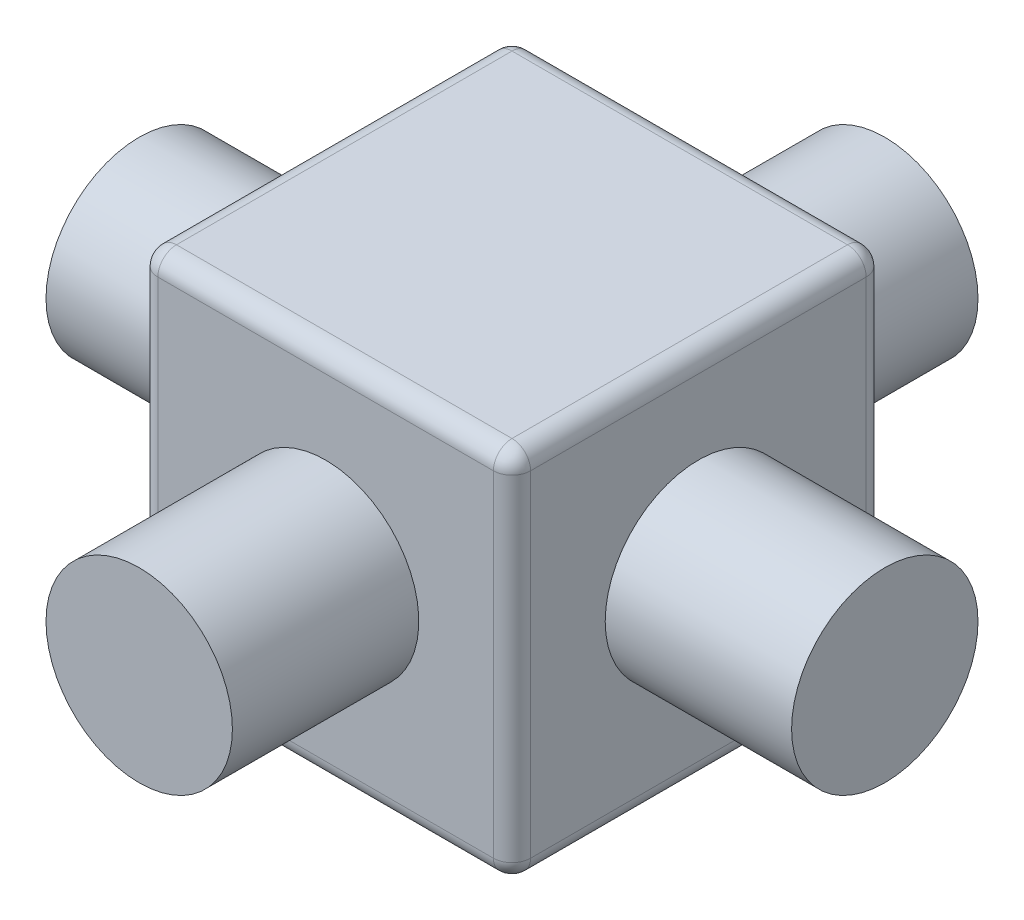
ISO-10303-21;
HEADER;
FILE_DESCRIPTION(('STEP AP214'),'2;1');
FILE_NAME('part.step','',(''),(''),'','','');
FILE_SCHEMA(('AUTOMOTIVE_DESIGN { 1 0 10303 214 1 1 1 1 }'));
ENDSEC;
DATA;
#1=APPLICATION_CONTEXT('core data for automotive mechanical design processes');
#2=APPLICATION_PROTOCOL_DEFINITION('international standard','automotive_design',2000,#1);
#3=PRODUCT_CONTEXT('',#1,'mechanical');
#4=PRODUCT('Part','Part','',(#3));
#5=PRODUCT_RELATED_PRODUCT_CATEGORY('part','',(#4));
#6=PRODUCT_DEFINITION_FORMATION('','',#4);
#7=PRODUCT_DEFINITION_CONTEXT('part definition',#1,'design');
#8=PRODUCT_DEFINITION('design','',#6,#7);
#9=PRODUCT_DEFINITION_SHAPE('','',#8);
#10=(LENGTH_UNIT() NAMED_UNIT(*) SI_UNIT(.MILLI.,.METRE.));
#11=(NAMED_UNIT(*) PLANE_ANGLE_UNIT() SI_UNIT($,.RADIAN.));
#12=(NAMED_UNIT(*) SI_UNIT($,.STERADIAN.) SOLID_ANGLE_UNIT());
#13=UNCERTAINTY_MEASURE_WITH_UNIT(LENGTH_MEASURE(1.E-05),#10,'distance_accuracy_value','');
#14=(GEOMETRIC_REPRESENTATION_CONTEXT(3) GLOBAL_UNCERTAINTY_ASSIGNED_CONTEXT((#13)) GLOBAL_UNIT_ASSIGNED_CONTEXT((#10,
#11,#12)) REPRESENTATION_CONTEXT('',''));
#15=CARTESIAN_POINT('',(0.,0.,0.));
#16=DIRECTION('',(0.,0.,1.));
#17=DIRECTION('',(1.,0.,0.));
#18=AXIS2_PLACEMENT_3D('',#15,#16,#17);
#19=CARTESIAN_POINT('',(3.,6.,3.));
#20=DIRECTION('',(-1.,0.,0.));
#21=DIRECTION('',(0.,0.,1.));
#22=AXIS2_PLACEMENT_3D('',#19,#20,#21);
#23=PLANE('',#22);
#24=CARTESIAN_POINT('',(3.,3.,0.));
#25=DIRECTION('',(-1.,0.,0.));
#26=DIRECTION('',(0.,0.,1.));
#27=AXIS2_PLACEMENT_3D('',#24,#25,#26);
#28=CIRCLE('',#27,1.5);
#29=CARTESIAN_POINT('',(3.,3.,1.49999999999997));
#30=VERTEX_POINT('',#29);
#31=EDGE_CURVE('E11',#30,#30,#28,.F.);
#32=ORIENTED_EDGE('',*,*,#31,.F.);
#33=EDGE_LOOP('',(#32));
#34=FACE_BOUND('',#33,.T.);
#35=DIRECTION('',(0.,0.,-1.));
#36=VECTOR('',#35,1.);
#37=CARTESIAN_POINT('',(3.,0.3,-3.));
#38=LINE('',#37,#36);
#39=CARTESIAN_POINT('',(3.,0.3,2.7));
#40=VERTEX_POINT('',#39);
#41=CARTESIAN_POINT('',(3.,0.3,-2.7));
#42=VERTEX_POINT('',#41);
#43=EDGE_CURVE('E335',#40,#42,#38,.T.);
#44=ORIENTED_EDGE('',*,*,#43,.T.);
#45=DIRECTION('',(0.,-1.,0.));
#46=VECTOR('',#45,1.);
#47=CARTESIAN_POINT('',(3.,6.,-2.7));
#48=LINE('',#47,#46);
#49=CARTESIAN_POINT('',(3.,5.7,-2.7));
#50=VERTEX_POINT('',#49);
#51=EDGE_CURVE('E338',#42,#50,#48,.F.);
#52=ORIENTED_EDGE('',*,*,#51,.T.);
#53=DIRECTION('',(0.,0.,-1.));
#54=VECTOR('',#53,1.);
#55=CARTESIAN_POINT('',(3.,5.7,3.));
#56=LINE('',#55,#54);
#57=CARTESIAN_POINT('',(3.,5.7,2.7));
#58=VERTEX_POINT('',#57);
#59=EDGE_CURVE('E329',#50,#58,#56,.F.);
#60=ORIENTED_EDGE('',*,*,#59,.T.);
#61=DIRECTION('',(0.,-1.,0.));
#62=VECTOR('',#61,1.);
#63=CARTESIAN_POINT('',(3.,6.,2.7));
#64=LINE('',#63,#62);
#65=EDGE_CURVE('E332',#58,#40,#64,.T.);
#66=ORIENTED_EDGE('',*,*,#65,.T.);
#67=EDGE_LOOP('',(#44,#52,#60,#66));
#68=FACE_BOUND('',#67,.T.);
#69=ADVANCED_FACE('F39',(#34,#68),#23,.F.);
#70=CARTESIAN_POINT('',(-3.,6.,-3.));
#71=DIRECTION('',(0.,0.,1.));
#72=DIRECTION('',(1.,0.,0.));
#73=AXIS2_PLACEMENT_3D('',#70,#71,#72);
#74=PLANE('',#73);
#75=CARTESIAN_POINT('',(0.,3.,-3.));
#76=DIRECTION('',(0.,0.,1.));
#77=DIRECTION('',(1.,0.,0.));
#78=AXIS2_PLACEMENT_3D('',#75,#76,#77);
#79=CIRCLE('',#78,1.5);
#80=CARTESIAN_POINT('',(1.5,3.,-3.));
#81=VERTEX_POINT('',#80);
#82=EDGE_CURVE('E226',#81,#81,#79,.F.);
#83=ORIENTED_EDGE('',*,*,#82,.F.);
#84=EDGE_LOOP('',(#83));
#85=FACE_BOUND('',#84,.T.);
#86=DIRECTION('',(-1.,0.,0.));
#87=VECTOR('',#86,1.);
#88=CARTESIAN_POINT('',(-3.,0.3,-3.));
#89=LINE('',#88,#87);
#90=CARTESIAN_POINT('',(2.7,0.3,-3.));
#91=VERTEX_POINT('',#90);
#92=CARTESIAN_POINT('',(-2.7,0.3,-3.));
#93=VERTEX_POINT('',#92);
#94=EDGE_CURVE('E322',#91,#93,#89,.T.);
#95=ORIENTED_EDGE('',*,*,#94,.T.);
#96=DIRECTION('',(0.,-1.,0.));
#97=VECTOR('',#96,1.);
#98=CARTESIAN_POINT('',(-2.7,6.,-3.));
#99=LINE('',#98,#97);
#100=CARTESIAN_POINT('',(-2.7,5.7,-3.));
#101=VERTEX_POINT('',#100);
#102=EDGE_CURVE('E325',#93,#101,#99,.F.);
#103=ORIENTED_EDGE('',*,*,#102,.T.);
#104=DIRECTION('',(-1.,0.,0.));
#105=VECTOR('',#104,1.);
#106=CARTESIAN_POINT('',(-3.,5.7,-3.));
#107=LINE('',#106,#105);
#108=CARTESIAN_POINT('',(2.7,5.7,-3.));
#109=VERTEX_POINT('',#108);
#110=EDGE_CURVE('E313',#101,#109,#107,.F.);
#111=ORIENTED_EDGE('',*,*,#110,.T.);
#112=DIRECTION('',(0.,-1.,0.));
#113=VECTOR('',#112,1.);
#114=CARTESIAN_POINT('',(2.7,6.,-3.));
#115=LINE('',#114,#113);
#116=EDGE_CURVE('E316',#109,#91,#115,.T.);
#117=ORIENTED_EDGE('',*,*,#116,.T.);
#118=EDGE_LOOP('',(#95,#103,#111,#117));
#119=FACE_BOUND('',#118,.T.);
#120=ADVANCED_FACE('F361',(#85,#119),#74,.F.);
#121=CARTESIAN_POINT('',(-3.,6.,3.));
#122=DIRECTION('',(1.,0.,0.));
#123=DIRECTION('',(0.,0.,-1.));
#124=AXIS2_PLACEMENT_3D('',#121,#122,#123);
#125=PLANE('',#124);
#126=CARTESIAN_POINT('',(-3.,3.,0.));
#127=DIRECTION('',(1.,0.,0.));
#128=DIRECTION('',(0.,0.,-1.));
#129=AXIS2_PLACEMENT_3D('',#126,#127,#128);
#130=CIRCLE('',#129,1.5);
#131=CARTESIAN_POINT('',(-3.,3.,-1.49999999999999));
#132=VERTEX_POINT('',#131);
#133=EDGE_CURVE('E230',#132,#132,#130,.F.);
#134=ORIENTED_EDGE('',*,*,#133,.F.);
#135=EDGE_LOOP('',(#134));
#136=FACE_BOUND('',#135,.T.);
#137=DIRECTION('',(0.,-1.,0.));
#138=VECTOR('',#137,1.);
#139=CARTESIAN_POINT('',(-3.,6.,-2.7));
#140=LINE('',#139,#138);
#141=CARTESIAN_POINT('',(-3.,5.7,-2.7));
#142=VERTEX_POINT('',#141);
#143=CARTESIAN_POINT('',(-3.,0.3,-2.7));
#144=VERTEX_POINT('',#143);
#145=EDGE_CURVE('E139',#142,#144,#140,.T.);
#146=ORIENTED_EDGE('',*,*,#145,.T.);
#147=DIRECTION('',(0.,0.,1.));
#148=VECTOR('',#147,1.);
#149=CARTESIAN_POINT('',(-3.,0.3,3.));
#150=LINE('',#149,#148);
#151=CARTESIAN_POINT('',(-3.,0.3,2.7));
#152=VERTEX_POINT('',#151);
#153=EDGE_CURVE('E134',#144,#152,#150,.T.);
#154=ORIENTED_EDGE('',*,*,#153,.T.);
#155=DIRECTION('',(0.,-1.,0.));
#156=VECTOR('',#155,1.);
#157=CARTESIAN_POINT('',(-3.,6.,2.7));
#158=LINE('',#157,#156);
#159=CARTESIAN_POINT('',(-3.,5.7,2.7));
#160=VERTEX_POINT('',#159);
#161=EDGE_CURVE('E128',#152,#160,#158,.F.);
#162=ORIENTED_EDGE('',*,*,#161,.T.);
#163=DIRECTION('',(0.,0.,1.));
#164=VECTOR('',#163,1.);
#165=CARTESIAN_POINT('',(-3.,5.7,3.));
#166=LINE('',#165,#164);
#167=EDGE_CURVE('E131',#160,#142,#166,.F.);
#168=ORIENTED_EDGE('',*,*,#167,.T.);
#169=EDGE_LOOP('',(#146,#154,#162,#168));
#170=FACE_BOUND('',#169,.T.);
#171=ADVANCED_FACE('F130',(#136,#170),#125,.F.);
#172=CARTESIAN_POINT('',(-3.,6.,3.));
#173=DIRECTION('',(0.,0.,-1.));
#174=DIRECTION('',(-1.,0.,0.));
#175=AXIS2_PLACEMENT_3D('',#172,#173,#174);
#176=PLANE('',#175);
#177=CARTESIAN_POINT('',(0.,3.,3.));
#178=DIRECTION('',(0.,0.,-1.));
#179=DIRECTION('',(-1.,0.,0.));
#180=AXIS2_PLACEMENT_3D('',#177,#178,#179);
#181=CIRCLE('',#180,1.5);
#182=CARTESIAN_POINT('',(-1.5,3.,3.));
#183=VERTEX_POINT('',#182);
#184=EDGE_CURVE('E48',#183,#183,#181,.F.);
#185=ORIENTED_EDGE('',*,*,#184,.F.);
#186=EDGE_LOOP('',(#185));
#187=FACE_BOUND('',#186,.T.);
#188=DIRECTION('',(0.,-1.,0.));
#189=VECTOR('',#188,1.);
#190=CARTESIAN_POINT('',(-2.7,6.,3.));
#191=LINE('',#190,#189);
#192=CARTESIAN_POINT('',(-2.7,5.7,3.));
#193=VERTEX_POINT('',#192);
#194=CARTESIAN_POINT('',(-2.7,0.3,3.));
#195=VERTEX_POINT('',#194);
#196=EDGE_CURVE('E164',#193,#195,#191,.T.);
#197=ORIENTED_EDGE('',*,*,#196,.T.);
#198=DIRECTION('',(1.,0.,0.));
#199=VECTOR('',#198,1.);
#200=CARTESIAN_POINT('',(3.,0.3,3.));
#201=LINE('',#200,#199);
#202=CARTESIAN_POINT('',(2.7,0.3,3.));
#203=VERTEX_POINT('',#202);
#204=EDGE_CURVE('E246',#195,#203,#201,.T.);
#205=ORIENTED_EDGE('',*,*,#204,.T.);
#206=DIRECTION('',(0.,-1.,0.));
#207=VECTOR('',#206,1.);
#208=CARTESIAN_POINT('',(2.7,6.,3.));
#209=LINE('',#208,#207);
#210=CARTESIAN_POINT('',(2.7,5.7,3.));
#211=VERTEX_POINT('',#210);
#212=EDGE_CURVE('E251',#203,#211,#209,.F.);
#213=ORIENTED_EDGE('',*,*,#212,.T.);
#214=DIRECTION('',(1.,0.,0.));
#215=VECTOR('',#214,1.);
#216=CARTESIAN_POINT('',(-3.,5.7,3.));
#217=LINE('',#216,#215);
#218=EDGE_CURVE('E249',#211,#193,#217,.F.);
#219=ORIENTED_EDGE('',*,*,#218,.T.);
#220=EDGE_LOOP('',(#197,#205,#213,#219));
#221=FACE_BOUND('',#220,.T.);
#222=ADVANCED_FACE('F240',(#187,#221),#176,.F.);
#223=CARTESIAN_POINT('',(0.,6.,0.));
#224=DIRECTION('',(0.,-1.,0.));
#225=DIRECTION('',(0.,0.,-1.));
#226=AXIS2_PLACEMENT_3D('',#223,#224,#225);
#227=PLANE('',#226);
#228=DIRECTION('',(0.,0.,1.));
#229=VECTOR('',#228,1.);
#230=CARTESIAN_POINT('',(-2.7,6.,0.));
#231=LINE('',#230,#229);
#232=CARTESIAN_POINT('',(-2.7,6.,-2.7));
#233=VERTEX_POINT('',#232);
#234=CARTESIAN_POINT('',(-2.7,6.,2.7));
#235=VERTEX_POINT('',#234);
#236=EDGE_CURVE('E55',#233,#235,#231,.T.);
#237=ORIENTED_EDGE('',*,*,#236,.T.);
#238=DIRECTION('',(1.,0.,0.));
#239=VECTOR('',#238,1.);
#240=CARTESIAN_POINT('',(0.,6.,2.7));
#241=LINE('',#240,#239);
#242=CARTESIAN_POINT('',(2.7,6.,2.7));
#243=VERTEX_POINT('',#242);
#244=EDGE_CURVE('E231',#235,#243,#241,.T.);
#245=ORIENTED_EDGE('',*,*,#244,.T.);
#246=DIRECTION('',(0.,0.,-1.));
#247=VECTOR('',#246,1.);
#248=CARTESIAN_POINT('',(2.7,6.,0.));
#249=LINE('',#248,#247);
#250=CARTESIAN_POINT('',(2.7,6.,-2.7));
#251=VERTEX_POINT('',#250);
#252=EDGE_CURVE('E255',#243,#251,#249,.T.);
#253=ORIENTED_EDGE('',*,*,#252,.T.);
#254=DIRECTION('',(-1.,0.,0.));
#255=VECTOR('',#254,1.);
#256=CARTESIAN_POINT('',(0.,6.,-2.7));
#257=LINE('',#256,#255);
#258=EDGE_CURVE('E60',#251,#233,#257,.T.);
#259=ORIENTED_EDGE('',*,*,#258,.T.);
#260=EDGE_LOOP('',(#237,#245,#253,#259));
#261=FACE_BOUND('',#260,.T.);
#262=ADVANCED_FACE('F243',(#261),#227,.F.);
#263=CARTESIAN_POINT('',(0.,0.,0.));
#264=DIRECTION('',(0.,-1.,0.));
#265=DIRECTION('',(0.,0.,-1.));
#266=AXIS2_PLACEMENT_3D('',#263,#264,#265);
#267=PLANE('',#266);
#268=DIRECTION('',(1.,0.,0.));
#269=VECTOR('',#268,1.);
#270=CARTESIAN_POINT('',(-3.,0.,2.7));
#271=LINE('',#270,#269);
#272=CARTESIAN_POINT('',(2.7,0.,2.7));
#273=VERTEX_POINT('',#272);
#274=CARTESIAN_POINT('',(-2.7,0.,2.7));
#275=VERTEX_POINT('',#274);
#276=EDGE_CURVE('E308',#273,#275,#271,.F.);
#277=ORIENTED_EDGE('',*,*,#276,.T.);
#278=DIRECTION('',(0.,0.,1.));
#279=VECTOR('',#278,1.);
#280=CARTESIAN_POINT('',(-2.7,0.,-3.));
#281=LINE('',#280,#279);
#282=CARTESIAN_POINT('',(-2.7,0.,-2.7));
#283=VERTEX_POINT('',#282);
#284=EDGE_CURVE('E302',#275,#283,#281,.F.);
#285=ORIENTED_EDGE('',*,*,#284,.T.);
#286=DIRECTION('',(-1.,0.,0.));
#287=VECTOR('',#286,1.);
#288=CARTESIAN_POINT('',(3.,0.,-2.7));
#289=LINE('',#288,#287);
#290=CARTESIAN_POINT('',(2.7,0.,-2.7));
#291=VERTEX_POINT('',#290);
#292=EDGE_CURVE('E295',#283,#291,#289,.F.);
#293=ORIENTED_EDGE('',*,*,#292,.T.);
#294=DIRECTION('',(0.,0.,-1.));
#295=VECTOR('',#294,1.);
#296=CARTESIAN_POINT('',(2.7,0.,3.));
#297=LINE('',#296,#295);
#298=EDGE_CURVE('E303',#291,#273,#297,.F.);
#299=ORIENTED_EDGE('',*,*,#298,.T.);
#300=EDGE_LOOP('',(#277,#285,#293,#299));
#301=FACE_BOUND('',#300,.T.);
#302=ADVANCED_FACE('F306',(#301),#267,.T.);
#303=CARTESIAN_POINT('',(2.7,5.7,0.));
#304=DIRECTION('',(0.,0.,-1.));
#305=DIRECTION('',(-1.,0.,0.));
#306=AXIS2_PLACEMENT_3D('',#303,#304,#305);
#307=CYLINDRICAL_SURFACE('',#306,0.3);
#308=CARTESIAN_POINT('',(2.7,5.7,-2.7));
#309=DIRECTION('',(0.,0.,-1.));
#310=DIRECTION('',(-1.,0.,0.));
#311=AXIS2_PLACEMENT_3D('',#308,#309,#310);
#312=CIRCLE('',#311,0.3);
#313=EDGE_CURVE('E151',#251,#50,#312,.T.);
#314=ORIENTED_EDGE('',*,*,#313,.F.);
#315=ORIENTED_EDGE('',*,*,#252,.F.);
#316=CARTESIAN_POINT('',(2.7,5.7,2.7));
#317=DIRECTION('',(0.,0.,1.));
#318=DIRECTION('',(1.,0.,0.));
#319=AXIS2_PLACEMENT_3D('',#316,#317,#318);
#320=CIRCLE('',#319,0.3);
#321=EDGE_CURVE('E219',#58,#243,#320,.T.);
#322=ORIENTED_EDGE('',*,*,#321,.F.);
#323=ORIENTED_EDGE('',*,*,#59,.F.);
#324=EDGE_LOOP('',(#314,#315,#322,#323));
#325=FACE_BOUND('',#324,.T.);
#326=ADVANCED_FACE('F41',(#325),#307,.T.);
#327=CARTESIAN_POINT('',(2.7,5.7,-2.7));
#328=DIRECTION('',(1.,0.,0.));
#329=DIRECTION('',(0.,0.,-1.));
#330=AXIS2_PLACEMENT_3D('',#327,#328,#329);
#331=SPHERICAL_SURFACE('',#330,0.3);
#332=CARTESIAN_POINT('',(2.7,5.7,-2.7));
#333=DIRECTION('',(1.,0.,0.));
#334=DIRECTION('',(0.,0.,-1.));
#335=AXIS2_PLACEMENT_3D('',#332,#333,#334);
#336=CIRCLE('',#335,0.3);
#337=EDGE_CURVE('E212',#251,#109,#336,.F.);
#338=ORIENTED_EDGE('',*,*,#337,.F.);
#339=ORIENTED_EDGE('',*,*,#313,.T.);
#340=CARTESIAN_POINT('',(2.7,5.7,-2.7));
#341=DIRECTION('',(0.,1.,0.));
#342=DIRECTION('',(0.,0.,1.));
#343=AXIS2_PLACEMENT_3D('',#340,#341,#342);
#344=CIRCLE('',#343,0.3);
#345=EDGE_CURVE('E216',#109,#50,#344,.F.);
#346=ORIENTED_EDGE('',*,*,#345,.F.);
#347=EDGE_LOOP('',(#338,#339,#346));
#348=FACE_BOUND('',#347,.T.);
#349=ADVANCED_FACE('F373',(#348),#331,.T.);
#350=CARTESIAN_POINT('',(2.7,5.7,2.7));
#351=DIRECTION('',(0.,1.,0.));
#352=DIRECTION('',(0.,0.,1.));
#353=AXIS2_PLACEMENT_3D('',#350,#351,#352);
#354=SPHERICAL_SURFACE('',#353,0.3);
#355=CARTESIAN_POINT('',(2.7,5.7,2.7));
#356=DIRECTION('',(0.,1.,0.));
#357=DIRECTION('',(0.,0.,1.));
#358=AXIS2_PLACEMENT_3D('',#355,#356,#357);
#359=CIRCLE('',#358,0.3);
#360=EDGE_CURVE('E205',#58,#211,#359,.F.);
#361=ORIENTED_EDGE('',*,*,#360,.F.);
#362=ORIENTED_EDGE('',*,*,#321,.T.);
#363=CARTESIAN_POINT('',(2.7,5.7,2.7));
#364=DIRECTION('',(1.,0.,0.));
#365=DIRECTION('',(0.,0.,-1.));
#366=AXIS2_PLACEMENT_3D('',#363,#364,#365);
#367=CIRCLE('',#366,0.3);
#368=EDGE_CURVE('E209',#211,#243,#367,.F.);
#369=ORIENTED_EDGE('',*,*,#368,.F.);
#370=EDGE_LOOP('',(#361,#362,#369));
#371=FACE_BOUND('',#370,.T.);
#372=ADVANCED_FACE('F381',(#371),#354,.T.);
#373=CARTESIAN_POINT('',(2.7,6.,-2.7));
#374=DIRECTION('',(0.,-1.,0.));
#375=DIRECTION('',(0.,0.,-1.));
#376=AXIS2_PLACEMENT_3D('',#373,#374,#375);
#377=CYLINDRICAL_SURFACE('',#376,0.3);
#378=ORIENTED_EDGE('',*,*,#345,.T.);
#379=ORIENTED_EDGE('',*,*,#51,.F.);
#380=CARTESIAN_POINT('',(2.7,0.3,-2.7));
#381=DIRECTION('',(0.,-1.,0.));
#382=DIRECTION('',(0.,0.,-1.));
#383=AXIS2_PLACEMENT_3D('',#380,#381,#382);
#384=CIRCLE('',#383,0.3);
#385=EDGE_CURVE('E197',#91,#42,#384,.T.);
#386=ORIENTED_EDGE('',*,*,#385,.F.);
#387=ORIENTED_EDGE('',*,*,#116,.F.);
#388=EDGE_LOOP('',(#378,#379,#386,#387));
#389=FACE_BOUND('',#388,.T.);
#390=ADVANCED_FACE('F350',(#389),#377,.T.);
#391=CARTESIAN_POINT('',(0.,5.7,-2.7));
#392=DIRECTION('',(-1.,0.,0.));
#393=DIRECTION('',(0.,0.,1.));
#394=AXIS2_PLACEMENT_3D('',#391,#392,#393);
#395=CYLINDRICAL_SURFACE('',#394,0.3);
#396=ORIENTED_EDGE('',*,*,#337,.T.);
#397=ORIENTED_EDGE('',*,*,#110,.F.);
#398=CARTESIAN_POINT('',(-2.7,5.7,-2.7));
#399=DIRECTION('',(-1.,0.,0.));
#400=DIRECTION('',(0.,0.,1.));
#401=AXIS2_PLACEMENT_3D('',#398,#399,#400);
#402=CIRCLE('',#401,0.3);
#403=EDGE_CURVE('E193',#233,#101,#402,.T.);
#404=ORIENTED_EDGE('',*,*,#403,.F.);
#405=ORIENTED_EDGE('',*,*,#258,.F.);
#406=EDGE_LOOP('',(#396,#397,#404,#405));
#407=FACE_BOUND('',#406,.T.);
#408=ADVANCED_FACE('F370',(#407),#395,.T.);
#409=CARTESIAN_POINT('',(-2.7,5.7,0.));
#410=DIRECTION('',(0.,0.,1.));
#411=DIRECTION('',(1.,0.,0.));
#412=AXIS2_PLACEMENT_3D('',#409,#410,#411);
#413=CYLINDRICAL_SURFACE('',#412,0.3);
#414=CARTESIAN_POINT('',(-2.7,5.7,2.7));
#415=DIRECTION('',(0.,0.,1.));
#416=DIRECTION('',(1.,0.,0.));
#417=AXIS2_PLACEMENT_3D('',#414,#415,#416);
#418=CIRCLE('',#417,0.3);
#419=EDGE_CURVE('E145',#235,#160,#418,.T.);
#420=ORIENTED_EDGE('',*,*,#419,.F.);
#421=ORIENTED_EDGE('',*,*,#236,.F.);
#422=CARTESIAN_POINT('',(-2.7,5.7,-2.7));
#423=DIRECTION('',(0.,0.,-1.));
#424=DIRECTION('',(-1.,0.,0.));
#425=AXIS2_PLACEMENT_3D('',#422,#423,#424);
#426=CIRCLE('',#425,0.3);
#427=EDGE_CURVE('E148',#142,#233,#426,.T.);
#428=ORIENTED_EDGE('',*,*,#427,.F.);
#429=ORIENTED_EDGE('',*,*,#167,.F.);
#430=EDGE_LOOP('',(#420,#421,#428,#429));
#431=FACE_BOUND('',#430,.T.);
#432=ADVANCED_FACE('F144',(#431),#413,.T.);
#433=CARTESIAN_POINT('',(0.,5.7,2.7));
#434=DIRECTION('',(1.,0.,0.));
#435=DIRECTION('',(0.,0.,-1.));
#436=AXIS2_PLACEMENT_3D('',#433,#434,#435);
#437=CYLINDRICAL_SURFACE('',#436,0.3);
#438=ORIENTED_EDGE('',*,*,#368,.T.);
#439=ORIENTED_EDGE('',*,*,#244,.F.);
#440=CARTESIAN_POINT('',(-2.7,5.7,2.7));
#441=DIRECTION('',(-1.,0.,0.));
#442=DIRECTION('',(0.,0.,1.));
#443=AXIS2_PLACEMENT_3D('',#440,#441,#442);
#444=CIRCLE('',#443,0.3);
#445=EDGE_CURVE('E159',#193,#235,#444,.T.);
#446=ORIENTED_EDGE('',*,*,#445,.F.);
#447=ORIENTED_EDGE('',*,*,#218,.F.);
#448=EDGE_LOOP('',(#438,#439,#446,#447));
#449=FACE_BOUND('',#448,.T.);
#450=ADVANCED_FACE('F461',(#449),#437,.T.);
#451=CARTESIAN_POINT('',(2.7,6.,2.7));
#452=DIRECTION('',(0.,-1.,0.));
#453=DIRECTION('',(0.,0.,-1.));
#454=AXIS2_PLACEMENT_3D('',#451,#452,#453);
#455=CYLINDRICAL_SURFACE('',#454,0.3);
#456=ORIENTED_EDGE('',*,*,#360,.T.);
#457=ORIENTED_EDGE('',*,*,#212,.F.);
#458=CARTESIAN_POINT('',(2.7,0.3,2.7));
#459=DIRECTION('',(0.,-1.,0.));
#460=DIRECTION('',(0.,0.,-1.));
#461=AXIS2_PLACEMENT_3D('',#458,#459,#460);
#462=CIRCLE('',#461,0.3);
#463=EDGE_CURVE('E185',#40,#203,#462,.T.);
#464=ORIENTED_EDGE('',*,*,#463,.F.);
#465=ORIENTED_EDGE('',*,*,#65,.F.);
#466=EDGE_LOOP('',(#456,#457,#464,#465));
#467=FACE_BOUND('',#466,.T.);
#468=ADVANCED_FACE('F383',(#467),#455,.T.);
#469=CARTESIAN_POINT('',(2.7,0.3,3.));
#470=DIRECTION('',(0.,0.,1.));
#471=DIRECTION('',(1.,0.,0.));
#472=AXIS2_PLACEMENT_3D('',#469,#470,#471);
#473=CYLINDRICAL_SURFACE('',#472,0.3);
#474=CARTESIAN_POINT('',(2.7,0.3,-2.7));
#475=DIRECTION('',(0.,0.,-1.));
#476=DIRECTION('',(-1.,0.,0.));
#477=AXIS2_PLACEMENT_3D('',#474,#475,#476);
#478=CIRCLE('',#477,0.3);
#479=EDGE_CURVE('E201',#42,#291,#478,.T.);
#480=ORIENTED_EDGE('',*,*,#479,.F.);
#481=ORIENTED_EDGE('',*,*,#43,.F.);
#482=CARTESIAN_POINT('',(2.7,0.3,2.7));
#483=DIRECTION('',(0.,0.,1.));
#484=DIRECTION('',(1.,0.,0.));
#485=AXIS2_PLACEMENT_3D('',#482,#483,#484);
#486=CIRCLE('',#485,0.3);
#487=EDGE_CURVE('E181',#273,#40,#486,.T.);
#488=ORIENTED_EDGE('',*,*,#487,.F.);
#489=ORIENTED_EDGE('',*,*,#298,.F.);
#490=EDGE_LOOP('',(#480,#481,#488,#489));
#491=FACE_BOUND('',#490,.T.);
#492=ADVANCED_FACE('F354',(#491),#473,.T.);
#493=CARTESIAN_POINT('',(2.7,0.3,-2.7));
#494=DIRECTION('',(1.,0.,0.));
#495=DIRECTION('',(0.,1.,0.));
#496=AXIS2_PLACEMENT_3D('',#493,#494,#495);
#497=SPHERICAL_SURFACE('',#496,0.3);
#498=ORIENTED_EDGE('',*,*,#385,.T.);
#499=ORIENTED_EDGE('',*,*,#479,.T.);
#500=CARTESIAN_POINT('',(2.7,0.3,-2.7));
#501=DIRECTION('',(1.,0.,0.));
#502=DIRECTION('',(0.,0.,-1.));
#503=AXIS2_PLACEMENT_3D('',#500,#501,#502);
#504=CIRCLE('',#503,0.3);
#505=EDGE_CURVE('E171',#91,#291,#504,.F.);
#506=ORIENTED_EDGE('',*,*,#505,.F.);
#507=EDGE_LOOP('',(#498,#499,#506));
#508=FACE_BOUND('',#507,.T.);
#509=ADVANCED_FACE('F358',(#508),#497,.T.);
#510=CARTESIAN_POINT('',(-2.7,5.7,-2.7));
#511=DIRECTION('',(0.,1.,0.));
#512=DIRECTION('',(0.,0.,1.));
#513=AXIS2_PLACEMENT_3D('',#510,#511,#512);
#514=SPHERICAL_SURFACE('',#513,0.3);
#515=ORIENTED_EDGE('',*,*,#427,.T.);
#516=ORIENTED_EDGE('',*,*,#403,.T.);
#517=CARTESIAN_POINT('',(-2.7,5.7,-2.7));
#518=DIRECTION('',(0.,1.,0.));
#519=DIRECTION('',(0.,0.,1.));
#520=AXIS2_PLACEMENT_3D('',#517,#518,#519);
#521=CIRCLE('',#520,0.3);
#522=EDGE_CURVE('E166',#142,#101,#521,.F.);
#523=ORIENTED_EDGE('',*,*,#522,.F.);
#524=EDGE_LOOP('',(#515,#516,#523));
#525=FACE_BOUND('',#524,.T.);
#526=ADVANCED_FACE('F368',(#525),#514,.T.);
#527=CARTESIAN_POINT('',(-2.7,5.7,2.7));
#528=DIRECTION('',(0.,1.,0.));
#529=DIRECTION('',(0.,0.,1.));
#530=AXIS2_PLACEMENT_3D('',#527,#528,#529);
#531=SPHERICAL_SURFACE('',#530,0.3);
#532=ORIENTED_EDGE('',*,*,#445,.T.);
#533=ORIENTED_EDGE('',*,*,#419,.T.);
#534=CARTESIAN_POINT('',(-2.7,5.7,2.7));
#535=DIRECTION('',(0.,1.,0.));
#536=DIRECTION('',(0.,0.,1.));
#537=AXIS2_PLACEMENT_3D('',#534,#535,#536);
#538=CIRCLE('',#537,0.3);
#539=EDGE_CURVE('E156',#193,#160,#538,.F.);
#540=ORIENTED_EDGE('',*,*,#539,.F.);
#541=EDGE_LOOP('',(#532,#533,#540));
#542=FACE_BOUND('',#541,.T.);
#543=ADVANCED_FACE('F155',(#542),#531,.T.);
#544=CARTESIAN_POINT('',(2.7,0.3,2.7));
#545=DIRECTION('',(1.,0.,0.));
#546=DIRECTION('',(0.,1.,0.));
#547=AXIS2_PLACEMENT_3D('',#544,#545,#546);
#548=SPHERICAL_SURFACE('',#547,0.3);
#549=ORIENTED_EDGE('',*,*,#487,.T.);
#550=ORIENTED_EDGE('',*,*,#463,.T.);
#551=CARTESIAN_POINT('',(2.7,0.3,2.7));
#552=DIRECTION('',(1.,0.,0.));
#553=DIRECTION('',(0.,0.,-1.));
#554=AXIS2_PLACEMENT_3D('',#551,#552,#553);
#555=CIRCLE('',#554,0.3);
#556=EDGE_CURVE('E167',#273,#203,#555,.F.);
#557=ORIENTED_EDGE('',*,*,#556,.F.);
#558=EDGE_LOOP('',(#549,#550,#557));
#559=FACE_BOUND('',#558,.T.);
#560=ADVANCED_FACE('F386',(#559),#548,.T.);
#561=CARTESIAN_POINT('',(-3.,0.3,-2.7));
#562=DIRECTION('',(1.,0.,0.));
#563=DIRECTION('',(0.,0.,-1.));
#564=AXIS2_PLACEMENT_3D('',#561,#562,#563);
#565=CYLINDRICAL_SURFACE('',#564,0.3);
#566=ORIENTED_EDGE('',*,*,#505,.T.);
#567=ORIENTED_EDGE('',*,*,#292,.F.);
#568=CARTESIAN_POINT('',(-2.7,0.3,-2.7));
#569=DIRECTION('',(-1.,0.,0.));
#570=DIRECTION('',(0.,0.,1.));
#571=AXIS2_PLACEMENT_3D('',#568,#569,#570);
#572=CIRCLE('',#571,0.3);
#573=EDGE_CURVE('E174',#93,#283,#572,.T.);
#574=ORIENTED_EDGE('',*,*,#573,.F.);
#575=ORIENTED_EDGE('',*,*,#94,.F.);
#576=EDGE_LOOP('',(#566,#567,#574,#575));
#577=FACE_BOUND('',#576,.T.);
#578=ADVANCED_FACE('F297',(#577),#565,.T.);
#579=CARTESIAN_POINT('',(-2.7,6.,-2.7));
#580=DIRECTION('',(0.,-1.,0.));
#581=DIRECTION('',(0.,0.,-1.));
#582=AXIS2_PLACEMENT_3D('',#579,#580,#581);
#583=CYLINDRICAL_SURFACE('',#582,0.3);
#584=ORIENTED_EDGE('',*,*,#522,.T.);
#585=ORIENTED_EDGE('',*,*,#102,.F.);
#586=CARTESIAN_POINT('',(-2.7,0.3,-2.7));
#587=DIRECTION('',(0.,-1.,0.));
#588=DIRECTION('',(0.,0.,-1.));
#589=AXIS2_PLACEMENT_3D('',#586,#587,#588);
#590=CIRCLE('',#589,0.3);
#591=EDGE_CURVE('E282',#144,#93,#590,.T.);
#592=ORIENTED_EDGE('',*,*,#591,.F.);
#593=ORIENTED_EDGE('',*,*,#145,.F.);
#594=EDGE_LOOP('',(#584,#585,#592,#593));
#595=FACE_BOUND('',#594,.T.);
#596=ADVANCED_FACE('F363',(#595),#583,.T.);
#597=CARTESIAN_POINT('',(-2.7,6.,2.7));
#598=DIRECTION('',(0.,-1.,0.));
#599=DIRECTION('',(0.,0.,-1.));
#600=AXIS2_PLACEMENT_3D('',#597,#598,#599);
#601=CYLINDRICAL_SURFACE('',#600,0.3);
#602=ORIENTED_EDGE('',*,*,#539,.T.);
#603=ORIENTED_EDGE('',*,*,#161,.F.);
#604=CARTESIAN_POINT('',(-2.7,0.3,2.7));
#605=DIRECTION('',(0.,-1.,0.));
#606=DIRECTION('',(0.,0.,-1.));
#607=AXIS2_PLACEMENT_3D('',#604,#605,#606);
#608=CIRCLE('',#607,0.3);
#609=EDGE_CURVE('E278',#195,#152,#608,.T.);
#610=ORIENTED_EDGE('',*,*,#609,.F.);
#611=ORIENTED_EDGE('',*,*,#196,.F.);
#612=EDGE_LOOP('',(#602,#603,#610,#611));
#613=FACE_BOUND('',#612,.T.);
#614=ADVANCED_FACE('F162',(#613),#601,.T.);
#615=CARTESIAN_POINT('',(-3.,0.3,2.7));
#616=DIRECTION('',(-1.,0.,0.));
#617=DIRECTION('',(0.,0.,1.));
#618=AXIS2_PLACEMENT_3D('',#615,#616,#617);
#619=CYLINDRICAL_SURFACE('',#618,0.3);
#620=ORIENTED_EDGE('',*,*,#556,.T.);
#621=ORIENTED_EDGE('',*,*,#204,.F.);
#622=CARTESIAN_POINT('',(-2.7,0.3,2.7));
#623=DIRECTION('',(-1.,0.,0.));
#624=DIRECTION('',(0.,0.,1.));
#625=AXIS2_PLACEMENT_3D('',#622,#623,#624);
#626=CIRCLE('',#625,0.3);
#627=EDGE_CURVE('E275',#275,#195,#626,.T.);
#628=ORIENTED_EDGE('',*,*,#627,.F.);
#629=ORIENTED_EDGE('',*,*,#276,.F.);
#630=EDGE_LOOP('',(#620,#621,#628,#629));
#631=FACE_BOUND('',#630,.T.);
#632=ADVANCED_FACE('F388',(#631),#619,.T.);
#633=CARTESIAN_POINT('',(-2.7,0.3,-2.7));
#634=DIRECTION('',(0.,0.,-1.));
#635=DIRECTION('',(0.,1.,0.));
#636=AXIS2_PLACEMENT_3D('',#633,#634,#635);
#637=SPHERICAL_SURFACE('',#636,0.3);
#638=ORIENTED_EDGE('',*,*,#591,.T.);
#639=ORIENTED_EDGE('',*,*,#573,.T.);
#640=CARTESIAN_POINT('',(-2.7,0.3,-2.7));
#641=DIRECTION('',(0.,0.,-1.));
#642=DIRECTION('',(-1.,0.,0.));
#643=AXIS2_PLACEMENT_3D('',#640,#641,#642);
#644=CIRCLE('',#643,0.3);
#645=EDGE_CURVE('E271',#144,#283,#644,.F.);
#646=ORIENTED_EDGE('',*,*,#645,.F.);
#647=EDGE_LOOP('',(#638,#639,#646));
#648=FACE_BOUND('',#647,.T.);
#649=ADVANCED_FACE('F291',(#648),#637,.T.);
#650=CARTESIAN_POINT('',(-2.7,0.3,2.7));
#651=DIRECTION('',(0.,0.,1.));
#652=DIRECTION('',(0.,-1.,0.));
#653=AXIS2_PLACEMENT_3D('',#650,#651,#652);
#654=SPHERICAL_SURFACE('',#653,0.3);
#655=ORIENTED_EDGE('',*,*,#627,.T.);
#656=ORIENTED_EDGE('',*,*,#609,.T.);
#657=CARTESIAN_POINT('',(-2.7,0.3,2.7));
#658=DIRECTION('',(0.,0.,1.));
#659=DIRECTION('',(1.,0.,0.));
#660=AXIS2_PLACEMENT_3D('',#657,#658,#659);
#661=CIRCLE('',#660,0.3);
#662=EDGE_CURVE('E268',#275,#152,#661,.F.);
#663=ORIENTED_EDGE('',*,*,#662,.F.);
#664=EDGE_LOOP('',(#655,#656,#663));
#665=FACE_BOUND('',#664,.T.);
#666=ADVANCED_FACE('F435',(#665),#654,.T.);
#667=CARTESIAN_POINT('',(-2.7,0.3,3.));
#668=DIRECTION('',(0.,0.,-1.));
#669=DIRECTION('',(-1.,0.,0.));
#670=AXIS2_PLACEMENT_3D('',#667,#668,#669);
#671=CYLINDRICAL_SURFACE('',#670,0.3);
#672=ORIENTED_EDGE('',*,*,#645,.T.);
#673=ORIENTED_EDGE('',*,*,#284,.F.);
#674=ORIENTED_EDGE('',*,*,#662,.T.);
#675=ORIENTED_EDGE('',*,*,#153,.F.);
#676=EDGE_LOOP('',(#672,#673,#674,#675));
#677=FACE_BOUND('',#676,.T.);
#678=ADVANCED_FACE('F431',(#677),#671,.T.);
#679=CARTESIAN_POINT('',(0.,3.,-6.));
#680=DIRECTION('',(0.,0.,1.));
#681=DIRECTION('',(1.,0.,0.));
#682=AXIS2_PLACEMENT_3D('',#679,#680,#681);
#683=CYLINDRICAL_SURFACE('',#682,1.5);
#684=CARTESIAN_POINT('',(0.,3.,-6.));
#685=DIRECTION('',(0.,0.,-1.));
#686=DIRECTION('',(-1.,0.,0.));
#687=AXIS2_PLACEMENT_3D('',#684,#685,#686);
#688=CIRCLE('',#687,1.5);
#689=CARTESIAN_POINT('',(-1.5,3.,-6.));
#690=VERTEX_POINT('',#689);
#691=EDGE_CURVE('E272',#690,#690,#688,.T.);
#692=ORIENTED_EDGE('',*,*,#691,.F.);
#693=EDGE_LOOP('',(#692));
#694=FACE_BOUND('',#693,.T.);
#695=ORIENTED_EDGE('',*,*,#82,.T.);
#696=EDGE_LOOP('',(#695));
#697=FACE_BOUND('',#696,.T.);
#698=ADVANCED_FACE('F434',(#694,#697),#683,.T.);
#699=CARTESIAN_POINT('',(0.,3.,-6.));
#700=DIRECTION('',(0.,0.,-1.));
#701=DIRECTION('',(-1.,0.,0.));
#702=AXIS2_PLACEMENT_3D('',#699,#700,#701);
#703=PLANE('',#702);
#704=ORIENTED_EDGE('',*,*,#691,.T.);
#705=EDGE_LOOP('',(#704));
#706=FACE_BOUND('',#705,.T.);
#707=ADVANCED_FACE('F494',(#706),#703,.T.);
#708=CARTESIAN_POINT('',(-6.,3.,0.));
#709=DIRECTION('',(1.,0.,0.));
#710=DIRECTION('',(0.,0.,-1.));
#711=AXIS2_PLACEMENT_3D('',#708,#709,#710);
#712=CYLINDRICAL_SURFACE('',#711,1.5);
#713=CARTESIAN_POINT('',(-6.,3.,0.));
#714=DIRECTION('',(-1.,0.,0.));
#715=DIRECTION('',(0.,0.,1.));
#716=AXIS2_PLACEMENT_3D('',#713,#714,#715);
#717=CIRCLE('',#716,1.5);
#718=CARTESIAN_POINT('',(-5.99999999999999,3.,1.50000000000002));
#719=VERTEX_POINT('',#718);
#720=EDGE_CURVE('E400',#719,#719,#717,.T.);
#721=ORIENTED_EDGE('',*,*,#720,.F.);
#722=EDGE_LOOP('',(#721));
#723=FACE_BOUND('',#722,.T.);
#724=ORIENTED_EDGE('',*,*,#133,.T.);
#725=EDGE_LOOP('',(#724));
#726=FACE_BOUND('',#725,.T.);
#727=ADVANCED_FACE('F491',(#723,#726),#712,.T.);
#728=CARTESIAN_POINT('',(-6.,3.,0.));
#729=DIRECTION('',(-1.,0.,0.));
#730=DIRECTION('',(0.,0.,1.));
#731=AXIS2_PLACEMENT_3D('',#728,#729,#730);
#732=PLANE('',#731);
#733=ORIENTED_EDGE('',*,*,#720,.T.);
#734=EDGE_LOOP('',(#733));
#735=FACE_BOUND('',#734,.T.);
#736=ADVANCED_FACE('F493',(#735),#732,.T.);
#737=CARTESIAN_POINT('',(0.,3.,6.));
#738=DIRECTION('',(0.,0.,-1.));
#739=DIRECTION('',(-1.,0.,0.));
#740=AXIS2_PLACEMENT_3D('',#737,#738,#739);
#741=CYLINDRICAL_SURFACE('',#740,1.5);
#742=CARTESIAN_POINT('',(0.,3.,6.));
#743=DIRECTION('',(0.,0.,1.));
#744=DIRECTION('',(1.,0.,0.));
#745=AXIS2_PLACEMENT_3D('',#742,#743,#744);
#746=CIRCLE('',#745,1.5);
#747=CARTESIAN_POINT('',(1.5,3.,6.));
#748=VERTEX_POINT('',#747);
#749=EDGE_CURVE('E404',#748,#748,#746,.T.);
#750=ORIENTED_EDGE('',*,*,#749,.F.);
#751=EDGE_LOOP('',(#750));
#752=FACE_BOUND('',#751,.T.);
#753=ORIENTED_EDGE('',*,*,#184,.T.);
#754=EDGE_LOOP('',(#753));
#755=FACE_BOUND('',#754,.T.);
#756=ADVANCED_FACE('F238',(#752,#755),#741,.T.);
#757=CARTESIAN_POINT('',(0.,3.,6.));
#758=DIRECTION('',(0.,0.,1.));
#759=DIRECTION('',(1.,0.,0.));
#760=AXIS2_PLACEMENT_3D('',#757,#758,#759);
#761=PLANE('',#760);
#762=ORIENTED_EDGE('',*,*,#749,.T.);
#763=EDGE_LOOP('',(#762));
#764=FACE_BOUND('',#763,.T.);
#765=ADVANCED_FACE('F418',(#764),#761,.T.);
#766=CARTESIAN_POINT('',(6.,3.,0.));
#767=DIRECTION('',(-1.,0.,0.));
#768=DIRECTION('',(0.,0.,1.));
#769=AXIS2_PLACEMENT_3D('',#766,#767,#768);
#770=CYLINDRICAL_SURFACE('',#769,1.5);
#771=CARTESIAN_POINT('',(6.,3.,0.));
#772=DIRECTION('',(1.,0.,0.));
#773=DIRECTION('',(0.,0.,-1.));
#774=AXIS2_PLACEMENT_3D('',#771,#772,#773);
#775=CIRCLE('',#774,1.5);
#776=CARTESIAN_POINT('',(5.99999999999998,3.,-1.50000000000006));
#777=VERTEX_POINT('',#776);
#778=EDGE_CURVE('E408',#777,#777,#775,.T.);
#779=ORIENTED_EDGE('',*,*,#778,.F.);
#780=EDGE_LOOP('',(#779));
#781=FACE_BOUND('',#780,.T.);
#782=ORIENTED_EDGE('',*,*,#31,.T.);
#783=EDGE_LOOP('',(#782));
#784=FACE_BOUND('',#783,.T.);
#785=ADVANCED_FACE('F415',(#781,#784),#770,.T.);
#786=CARTESIAN_POINT('',(6.,3.,0.));
#787=DIRECTION('',(1.,0.,0.));
#788=DIRECTION('',(0.,0.,-1.));
#789=AXIS2_PLACEMENT_3D('',#786,#787,#788);
#790=PLANE('',#789);
#791=ORIENTED_EDGE('',*,*,#778,.T.);
#792=EDGE_LOOP('',(#791));
#793=FACE_BOUND('',#792,.T.);
#794=ADVANCED_FACE('F413',(#793),#790,.T.);
#795=CLOSED_SHELL('',(#69,#120,#171,#222,#262,#302,#326,#349,#372,#390,#408,#432,#450,#468,#492,
#509,#526,#543,#560,#578,#596,#614,#632,#649,#666,#678,#698,#707,#727,#736,#756,#765,#785,#794));
#796=MANIFOLD_SOLID_BREP('B2',#795);
#797=ADVANCED_BREP_SHAPE_REPRESENTATION('',(#18,#796),#14);
#798=SHAPE_DEFINITION_REPRESENTATION(#9,#797);
ENDSEC;
END-ISO-10303-21;
